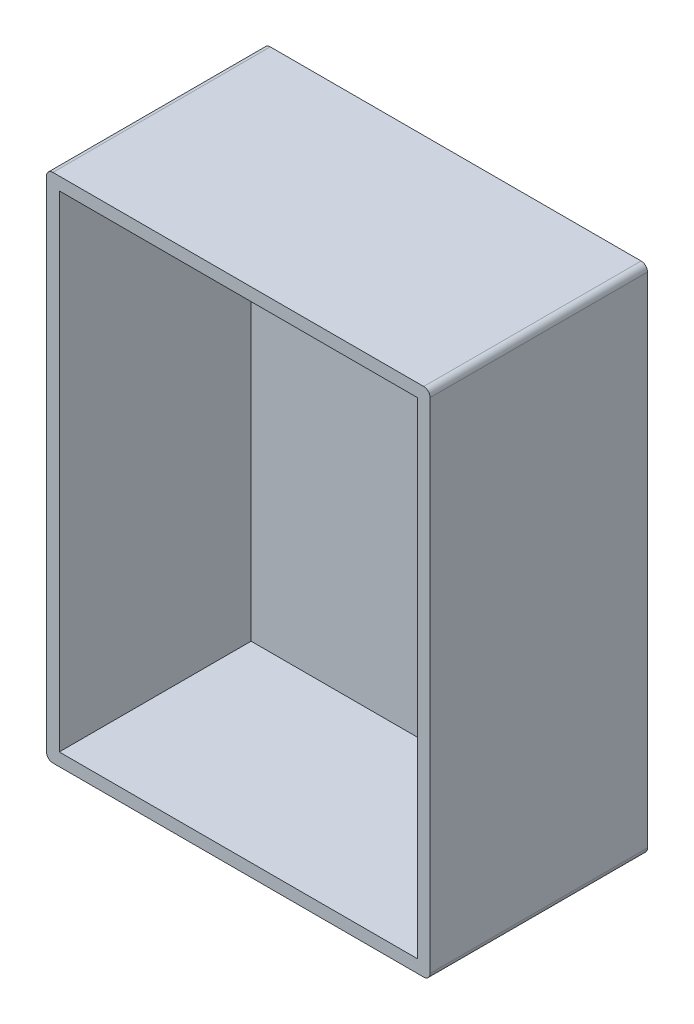
ISO-10303-21;
HEADER;
FILE_DESCRIPTION(('STEP AP214'),'2;1');
FILE_NAME('part.step','',(''),(''),'','','');
FILE_SCHEMA(('AUTOMOTIVE_DESIGN { 1 0 10303 214 1 1 1 1 }'));
ENDSEC;
DATA;
#1=APPLICATION_CONTEXT('core data for automotive mechanical design processes');
#2=APPLICATION_PROTOCOL_DEFINITION('international standard','automotive_design',2000,#1);
#3=PRODUCT_CONTEXT('',#1,'mechanical');
#4=PRODUCT('Part','Part','',(#3));
#5=PRODUCT_RELATED_PRODUCT_CATEGORY('part','',(#4));
#6=PRODUCT_DEFINITION_FORMATION('','',#4);
#7=PRODUCT_DEFINITION_CONTEXT('part definition',#1,'design');
#8=PRODUCT_DEFINITION('design','',#6,#7);
#9=PRODUCT_DEFINITION_SHAPE('','',#8);
#10=(LENGTH_UNIT() NAMED_UNIT(*) SI_UNIT(.MILLI.,.METRE.));
#11=(NAMED_UNIT(*) PLANE_ANGLE_UNIT() SI_UNIT($,.RADIAN.));
#12=(NAMED_UNIT(*) SI_UNIT($,.STERADIAN.) SOLID_ANGLE_UNIT());
#13=UNCERTAINTY_MEASURE_WITH_UNIT(LENGTH_MEASURE(1.E-05),#10,'distance_accuracy_value','');
#14=(GEOMETRIC_REPRESENTATION_CONTEXT(3) GLOBAL_UNCERTAINTY_ASSIGNED_CONTEXT((#13)) GLOBAL_UNIT_ASSIGNED_CONTEXT((#10,
#11,#12)) REPRESENTATION_CONTEXT('',''));
#15=CARTESIAN_POINT('',(0.,0.,0.));
#16=DIRECTION('',(0.,0.,1.));
#17=DIRECTION('',(1.,0.,0.));
#18=AXIS2_PLACEMENT_3D('',#15,#16,#17);
#19=CARTESIAN_POINT('',(150.,200.,170.));
#20=DIRECTION('',(-1.,0.,0.));
#21=DIRECTION('',(0.,0.,1.));
#22=AXIS2_PLACEMENT_3D('',#19,#20,#21);
#23=PLANE('',#22);
#24=DIRECTION('',(0.,1.,0.));
#25=VECTOR('',#24,1.);
#26=CARTESIAN_POINT('',(150.,200.,0.));
#27=LINE('',#26,#25);
#28=CARTESIAN_POINT('',(150.,-195.,0.));
#29=VERTEX_POINT('',#28);
#30=CARTESIAN_POINT('',(150.,195.,0.));
#31=VERTEX_POINT('',#30);
#32=EDGE_CURVE('E165',#29,#31,#27,.T.);
#33=ORIENTED_EDGE('',*,*,#32,.T.);
#34=DIRECTION('',(0.,0.,-1.));
#35=VECTOR('',#34,1.);
#36=CARTESIAN_POINT('',(150.,195.,170.));
#37=LINE('',#36,#35);
#38=CARTESIAN_POINT('',(150.,195.,170.));
#39=VERTEX_POINT('',#38);
#40=EDGE_CURVE('E217',#31,#39,#37,.F.);
#41=ORIENTED_EDGE('',*,*,#40,.T.);
#42=DIRECTION('',(0.,1.,0.));
#43=VECTOR('',#42,1.);
#44=CARTESIAN_POINT('',(150.,200.,170.));
#45=LINE('',#44,#43);
#46=CARTESIAN_POINT('',(150.,-195.,170.));
#47=VERTEX_POINT('',#46);
#48=EDGE_CURVE('E169',#47,#39,#45,.T.);
#49=ORIENTED_EDGE('',*,*,#48,.F.);
#50=DIRECTION('',(0.,0.,-1.));
#51=VECTOR('',#50,1.);
#52=CARTESIAN_POINT('',(150.,-195.,170.));
#53=LINE('',#52,#51);
#54=EDGE_CURVE('E214',#47,#29,#53,.T.);
#55=ORIENTED_EDGE('',*,*,#54,.T.);
#56=EDGE_LOOP('',(#33,#41,#49,#55));
#57=FACE_BOUND('',#56,.T.);
#58=ADVANCED_FACE('F37',(#57),#23,.F.);
#59=CARTESIAN_POINT('',(150.,200.,170.));
#60=DIRECTION('',(0.,-1.,0.));
#61=DIRECTION('',(1.,0.,0.));
#62=AXIS2_PLACEMENT_3D('',#59,#60,#61);
#63=PLANE('',#62);
#64=DIRECTION('',(-1.,0.,0.));
#65=VECTOR('',#64,1.);
#66=CARTESIAN_POINT('',(150.,200.,0.));
#67=LINE('',#66,#65);
#68=CARTESIAN_POINT('',(145.,200.,0.));
#69=VERTEX_POINT('',#68);
#70=CARTESIAN_POINT('',(-145.,200.,0.));
#71=VERTEX_POINT('',#70);
#72=EDGE_CURVE('E183',#69,#71,#67,.T.);
#73=ORIENTED_EDGE('',*,*,#72,.T.);
#74=DIRECTION('',(0.,0.,-1.));
#75=VECTOR('',#74,1.);
#76=CARTESIAN_POINT('',(-145.,200.,170.));
#77=LINE('',#76,#75);
#78=CARTESIAN_POINT('',(-145.,200.,170.));
#79=VERTEX_POINT('',#78);
#80=EDGE_CURVE('E205',#71,#79,#77,.F.);
#81=ORIENTED_EDGE('',*,*,#80,.T.);
#82=DIRECTION('',(-1.,0.,0.));
#83=VECTOR('',#82,1.);
#84=CARTESIAN_POINT('',(150.,200.,170.));
#85=LINE('',#84,#83);
#86=CARTESIAN_POINT('',(145.,200.,170.));
#87=VERTEX_POINT('',#86);
#88=EDGE_CURVE('E172',#87,#79,#85,.T.);
#89=ORIENTED_EDGE('',*,*,#88,.F.);
#90=DIRECTION('',(0.,0.,-1.));
#91=VECTOR('',#90,1.);
#92=CARTESIAN_POINT('',(145.,200.,170.));
#93=LINE('',#92,#91);
#94=EDGE_CURVE('E202',#87,#69,#93,.T.);
#95=ORIENTED_EDGE('',*,*,#94,.T.);
#96=EDGE_LOOP('',(#73,#81,#89,#95));
#97=FACE_BOUND('',#96,.T.);
#98=ADVANCED_FACE('F242',(#97),#63,.F.);
#99=CARTESIAN_POINT('',(-150.,200.,170.));
#100=DIRECTION('',(1.,0.,0.));
#101=DIRECTION('',(0.,0.,-1.));
#102=AXIS2_PLACEMENT_3D('',#99,#100,#101);
#103=PLANE('',#102);
#104=DIRECTION('',(0.,-1.,0.));
#105=VECTOR('',#104,1.);
#106=CARTESIAN_POINT('',(-150.,200.,170.));
#107=LINE('',#106,#105);
#108=CARTESIAN_POINT('',(-150.,195.,170.));
#109=VERTEX_POINT('',#108);
#110=CARTESIAN_POINT('',(-150.,-195.,170.));
#111=VERTEX_POINT('',#110);
#112=EDGE_CURVE('E176',#109,#111,#107,.T.);
#113=ORIENTED_EDGE('',*,*,#112,.F.);
#114=DIRECTION('',(0.,0.,-1.));
#115=VECTOR('',#114,1.);
#116=CARTESIAN_POINT('',(-150.,195.,170.));
#117=LINE('',#116,#115);
#118=CARTESIAN_POINT('',(-150.,195.,0.));
#119=VERTEX_POINT('',#118);
#120=EDGE_CURVE('E191',#109,#119,#117,.T.);
#121=ORIENTED_EDGE('',*,*,#120,.T.);
#122=DIRECTION('',(0.,-1.,0.));
#123=VECTOR('',#122,1.);
#124=CARTESIAN_POINT('',(-150.,200.,0.));
#125=LINE('',#124,#123);
#126=CARTESIAN_POINT('',(-150.,-195.,0.));
#127=VERTEX_POINT('',#126);
#128=EDGE_CURVE('E186',#119,#127,#125,.T.);
#129=ORIENTED_EDGE('',*,*,#128,.T.);
#130=DIRECTION('',(0.,0.,-1.));
#131=VECTOR('',#130,1.);
#132=CARTESIAN_POINT('',(-150.,-195.,170.));
#133=LINE('',#132,#131);
#134=EDGE_CURVE('E180',#127,#111,#133,.F.);
#135=ORIENTED_EDGE('',*,*,#134,.T.);
#136=EDGE_LOOP('',(#113,#121,#129,#135));
#137=FACE_BOUND('',#136,.T.);
#138=ADVANCED_FACE('F250',(#137),#103,.F.);
#139=CARTESIAN_POINT('',(150.,-200.,170.));
#140=DIRECTION('',(0.,1.,0.));
#141=DIRECTION('',(-1.,0.,0.));
#142=AXIS2_PLACEMENT_3D('',#139,#140,#141);
#143=PLANE('',#142);
#144=DIRECTION('',(1.,0.,0.));
#145=VECTOR('',#144,1.);
#146=CARTESIAN_POINT('',(150.,-200.,0.));
#147=LINE('',#146,#145);
#148=CARTESIAN_POINT('',(-145.,-200.,0.));
#149=VERTEX_POINT('',#148);
#150=CARTESIAN_POINT('',(145.,-200.,0.));
#151=VERTEX_POINT('',#150);
#152=EDGE_CURVE('E173',#149,#151,#147,.T.);
#153=ORIENTED_EDGE('',*,*,#152,.T.);
#154=DIRECTION('',(0.,0.,-1.));
#155=VECTOR('',#154,1.);
#156=CARTESIAN_POINT('',(145.,-200.,170.));
#157=LINE('',#156,#155);
#158=CARTESIAN_POINT('',(145.,-200.,170.));
#159=VERTEX_POINT('',#158);
#160=EDGE_CURVE('E11',#151,#159,#157,.F.);
#161=ORIENTED_EDGE('',*,*,#160,.T.);
#162=DIRECTION('',(1.,0.,0.));
#163=VECTOR('',#162,1.);
#164=CARTESIAN_POINT('',(150.,-200.,170.));
#165=LINE('',#164,#163);
#166=CARTESIAN_POINT('',(-145.,-200.,170.));
#167=VERTEX_POINT('',#166);
#168=EDGE_CURVE('E178',#167,#159,#165,.T.);
#169=ORIENTED_EDGE('',*,*,#168,.F.);
#170=DIRECTION('',(0.,0.,-1.));
#171=VECTOR('',#170,1.);
#172=CARTESIAN_POINT('',(-145.,-200.,170.));
#173=LINE('',#172,#171);
#174=EDGE_CURVE('E45',#167,#149,#173,.T.);
#175=ORIENTED_EDGE('',*,*,#174,.T.);
#176=EDGE_LOOP('',(#153,#161,#169,#175));
#177=FACE_BOUND('',#176,.T.);
#178=ADVANCED_FACE('F221',(#177),#143,.F.);
#179=CARTESIAN_POINT('',(0.,0.,170.));
#180=DIRECTION('',(0.,0.,-1.));
#181=DIRECTION('',(-1.,0.,0.));
#182=AXIS2_PLACEMENT_3D('',#179,#180,#181);
#183=PLANE('',#182);
#184=DIRECTION('',(1.,0.,0.));
#185=VECTOR('',#184,1.);
#186=CARTESIAN_POINT('',(-140.,-190.,170.));
#187=LINE('',#186,#185);
#188=CARTESIAN_POINT('',(-140.,-190.,170.));
#189=VERTEX_POINT('',#188);
#190=CARTESIAN_POINT('',(140.,-190.,170.));
#191=VERTEX_POINT('',#190);
#192=EDGE_CURVE('E159',#189,#191,#187,.T.);
#193=ORIENTED_EDGE('',*,*,#192,.F.);
#194=DIRECTION('',(0.,-1.,0.));
#195=VECTOR('',#194,1.);
#196=CARTESIAN_POINT('',(-140.,190.,170.));
#197=LINE('',#196,#195);
#198=CARTESIAN_POINT('',(-140.,190.,170.));
#199=VERTEX_POINT('',#198);
#200=EDGE_CURVE('E133',#199,#189,#197,.T.);
#201=ORIENTED_EDGE('',*,*,#200,.F.);
#202=DIRECTION('',(-1.,0.,0.));
#203=VECTOR('',#202,1.);
#204=CARTESIAN_POINT('',(-140.,190.,170.));
#205=LINE('',#204,#203);
#206=CARTESIAN_POINT('',(140.,190.,170.));
#207=VERTEX_POINT('',#206);
#208=EDGE_CURVE('E150',#207,#199,#205,.T.);
#209=ORIENTED_EDGE('',*,*,#208,.F.);
#210=DIRECTION('',(0.,1.,0.));
#211=VECTOR('',#210,1.);
#212=CARTESIAN_POINT('',(140.,190.,170.));
#213=LINE('',#212,#211);
#214=EDGE_CURVE('E153',#191,#207,#213,.T.);
#215=ORIENTED_EDGE('',*,*,#214,.F.);
#216=EDGE_LOOP('',(#193,#201,#209,#215));
#217=FACE_BOUND('',#216,.T.);
#218=ORIENTED_EDGE('',*,*,#88,.T.);
#219=CARTESIAN_POINT('',(-145.,195.,170.));
#220=DIRECTION('',(0.,0.,-1.));
#221=DIRECTION('',(-1.,0.,0.));
#222=AXIS2_PLACEMENT_3D('',#219,#220,#221);
#223=CIRCLE('',#222,5.);
#224=EDGE_CURVE('E212',#79,#109,#223,.F.);
#225=ORIENTED_EDGE('',*,*,#224,.T.);
#226=ORIENTED_EDGE('',*,*,#112,.T.);
#227=CARTESIAN_POINT('',(-145.,-195.,170.));
#228=DIRECTION('',(0.,0.,-1.));
#229=DIRECTION('',(-1.,0.,0.));
#230=AXIS2_PLACEMENT_3D('',#227,#228,#229);
#231=CIRCLE('',#230,5.);
#232=EDGE_CURVE('E57',#111,#167,#231,.F.);
#233=ORIENTED_EDGE('',*,*,#232,.T.);
#234=ORIENTED_EDGE('',*,*,#168,.T.);
#235=CARTESIAN_POINT('',(145.,-195.,170.));
#236=DIRECTION('',(0.,0.,-1.));
#237=DIRECTION('',(-1.,0.,0.));
#238=AXIS2_PLACEMENT_3D('',#235,#236,#237);
#239=CIRCLE('',#238,5.);
#240=EDGE_CURVE('E208',#159,#47,#239,.F.);
#241=ORIENTED_EDGE('',*,*,#240,.T.);
#242=ORIENTED_EDGE('',*,*,#48,.T.);
#243=CARTESIAN_POINT('',(145.,195.,170.));
#244=DIRECTION('',(0.,0.,-1.));
#245=DIRECTION('',(-1.,0.,0.));
#246=AXIS2_PLACEMENT_3D('',#243,#244,#245);
#247=CIRCLE('',#246,5.);
#248=EDGE_CURVE('E210',#39,#87,#247,.F.);
#249=ORIENTED_EDGE('',*,*,#248,.T.);
#250=EDGE_LOOP('',(#218,#225,#226,#233,#234,#241,#242,#249));
#251=FACE_BOUND('',#250,.T.);
#252=ADVANCED_FACE('F235',(#217,#251),#183,.F.);
#253=CARTESIAN_POINT('',(0.,0.,0.));
#254=DIRECTION('',(0.,0.,-1.));
#255=DIRECTION('',(-1.,0.,0.));
#256=AXIS2_PLACEMENT_3D('',#253,#254,#255);
#257=PLANE('',#256);
#258=ORIENTED_EDGE('',*,*,#128,.F.);
#259=CARTESIAN_POINT('',(-145.,195.,0.));
#260=DIRECTION('',(0.,0.,-1.));
#261=DIRECTION('',(-1.,0.,0.));
#262=AXIS2_PLACEMENT_3D('',#259,#260,#261);
#263=CIRCLE('',#262,5.);
#264=EDGE_CURVE('E200',#119,#71,#263,.T.);
#265=ORIENTED_EDGE('',*,*,#264,.T.);
#266=ORIENTED_EDGE('',*,*,#72,.F.);
#267=CARTESIAN_POINT('',(145.,195.,0.));
#268=DIRECTION('',(0.,0.,-1.));
#269=DIRECTION('',(-1.,0.,0.));
#270=AXIS2_PLACEMENT_3D('',#267,#268,#269);
#271=CIRCLE('',#270,5.);
#272=EDGE_CURVE('E198',#69,#31,#271,.T.);
#273=ORIENTED_EDGE('',*,*,#272,.T.);
#274=ORIENTED_EDGE('',*,*,#32,.F.);
#275=CARTESIAN_POINT('',(145.,-195.,0.));
#276=DIRECTION('',(0.,0.,-1.));
#277=DIRECTION('',(-1.,0.,0.));
#278=AXIS2_PLACEMENT_3D('',#275,#276,#277);
#279=CIRCLE('',#278,5.);
#280=EDGE_CURVE('E196',#29,#151,#279,.T.);
#281=ORIENTED_EDGE('',*,*,#280,.T.);
#282=ORIENTED_EDGE('',*,*,#152,.F.);
#283=CARTESIAN_POINT('',(-145.,-195.,0.));
#284=DIRECTION('',(0.,0.,-1.));
#285=DIRECTION('',(-1.,0.,0.));
#286=AXIS2_PLACEMENT_3D('',#283,#284,#285);
#287=CIRCLE('',#286,5.);
#288=EDGE_CURVE('E194',#149,#127,#287,.T.);
#289=ORIENTED_EDGE('',*,*,#288,.T.);
#290=EDGE_LOOP('',(#258,#265,#266,#273,#274,#281,#282,#289));
#291=FACE_BOUND('',#290,.T.);
#292=ADVANCED_FACE('F225',(#291),#257,.T.);
#293=CARTESIAN_POINT('',(-140.,190.,20.));
#294=DIRECTION('',(-1.,0.,0.));
#295=DIRECTION('',(0.,-1.,0.));
#296=AXIS2_PLACEMENT_3D('',#293,#294,#295);
#297=PLANE('',#296);
#298=ORIENTED_EDGE('',*,*,#200,.T.);
#299=DIRECTION('',(0.,0.,1.));
#300=VECTOR('',#299,1.);
#301=CARTESIAN_POINT('',(-140.,-190.,20.));
#302=LINE('',#301,#300);
#303=CARTESIAN_POINT('',(-140.,-190.,20.));
#304=VERTEX_POINT('',#303);
#305=EDGE_CURVE('E126',#304,#189,#302,.T.);
#306=ORIENTED_EDGE('',*,*,#305,.F.);
#307=DIRECTION('',(0.,-1.,0.));
#308=VECTOR('',#307,1.);
#309=CARTESIAN_POINT('',(-140.,190.,20.));
#310=LINE('',#309,#308);
#311=CARTESIAN_POINT('',(-140.,190.,20.));
#312=VERTEX_POINT('',#311);
#313=EDGE_CURVE('E130',#312,#304,#310,.T.);
#314=ORIENTED_EDGE('',*,*,#313,.F.);
#315=DIRECTION('',(0.,0.,1.));
#316=VECTOR('',#315,1.);
#317=CARTESIAN_POINT('',(-140.,190.,20.));
#318=LINE('',#317,#316);
#319=EDGE_CURVE('E163',#312,#199,#318,.T.);
#320=ORIENTED_EDGE('',*,*,#319,.T.);
#321=EDGE_LOOP('',(#298,#306,#314,#320));
#322=FACE_BOUND('',#321,.T.);
#323=ADVANCED_FACE('F128',(#322),#297,.F.);
#324=CARTESIAN_POINT('',(-140.,190.,20.));
#325=DIRECTION('',(0.,1.,0.));
#326=DIRECTION('',(0.,0.,1.));
#327=AXIS2_PLACEMENT_3D('',#324,#325,#326);
#328=PLANE('',#327);
#329=ORIENTED_EDGE('',*,*,#208,.T.);
#330=ORIENTED_EDGE('',*,*,#319,.F.);
#331=DIRECTION('',(-1.,0.,0.));
#332=VECTOR('',#331,1.);
#333=CARTESIAN_POINT('',(-140.,190.,20.));
#334=LINE('',#333,#332);
#335=CARTESIAN_POINT('',(140.,190.,20.));
#336=VERTEX_POINT('',#335);
#337=EDGE_CURVE('E138',#336,#312,#334,.T.);
#338=ORIENTED_EDGE('',*,*,#337,.F.);
#339=DIRECTION('',(0.,0.,1.));
#340=VECTOR('',#339,1.);
#341=CARTESIAN_POINT('',(140.,190.,20.));
#342=LINE('',#341,#340);
#343=EDGE_CURVE('E166',#336,#207,#342,.T.);
#344=ORIENTED_EDGE('',*,*,#343,.T.);
#345=EDGE_LOOP('',(#329,#330,#338,#344));
#346=FACE_BOUND('',#345,.T.);
#347=ADVANCED_FACE('F311',(#346),#328,.F.);
#348=CARTESIAN_POINT('',(140.,190.,20.));
#349=DIRECTION('',(1.,0.,0.));
#350=DIRECTION('',(0.,1.,0.));
#351=AXIS2_PLACEMENT_3D('',#348,#349,#350);
#352=PLANE('',#351);
#353=ORIENTED_EDGE('',*,*,#214,.T.);
#354=ORIENTED_EDGE('',*,*,#343,.F.);
#355=DIRECTION('',(0.,1.,0.));
#356=VECTOR('',#355,1.);
#357=CARTESIAN_POINT('',(140.,190.,20.));
#358=LINE('',#357,#356);
#359=CARTESIAN_POINT('',(140.,-190.,20.));
#360=VERTEX_POINT('',#359);
#361=EDGE_CURVE('E146',#360,#336,#358,.T.);
#362=ORIENTED_EDGE('',*,*,#361,.F.);
#363=DIRECTION('',(0.,0.,1.));
#364=VECTOR('',#363,1.);
#365=CARTESIAN_POINT('',(140.,-190.,20.));
#366=LINE('',#365,#364);
#367=EDGE_CURVE('E137',#360,#191,#366,.T.);
#368=ORIENTED_EDGE('',*,*,#367,.T.);
#369=EDGE_LOOP('',(#353,#354,#362,#368));
#370=FACE_BOUND('',#369,.T.);
#371=ADVANCED_FACE('F303',(#370),#352,.F.);
#372=CARTESIAN_POINT('',(-140.,-190.,20.));
#373=DIRECTION('',(0.,-1.,0.));
#374=DIRECTION('',(0.,0.,-1.));
#375=AXIS2_PLACEMENT_3D('',#372,#373,#374);
#376=PLANE('',#375);
#377=ORIENTED_EDGE('',*,*,#192,.T.);
#378=ORIENTED_EDGE('',*,*,#367,.F.);
#379=DIRECTION('',(1.,0.,0.));
#380=VECTOR('',#379,1.);
#381=CARTESIAN_POINT('',(-140.,-190.,20.));
#382=LINE('',#381,#380);
#383=EDGE_CURVE('E141',#304,#360,#382,.T.);
#384=ORIENTED_EDGE('',*,*,#383,.F.);
#385=ORIENTED_EDGE('',*,*,#305,.T.);
#386=EDGE_LOOP('',(#377,#378,#384,#385));
#387=FACE_BOUND('',#386,.T.);
#388=ADVANCED_FACE('F142',(#387),#376,.F.);
#389=CARTESIAN_POINT('',(0.,0.,20.));
#390=DIRECTION('',(0.,0.,1.));
#391=DIRECTION('',(1.,0.,0.));
#392=AXIS2_PLACEMENT_3D('',#389,#390,#391);
#393=PLANE('',#392);
#394=ORIENTED_EDGE('',*,*,#313,.T.);
#395=ORIENTED_EDGE('',*,*,#383,.T.);
#396=ORIENTED_EDGE('',*,*,#361,.T.);
#397=ORIENTED_EDGE('',*,*,#337,.T.);
#398=EDGE_LOOP('',(#394,#395,#396,#397));
#399=FACE_BOUND('',#398,.T.);
#400=ADVANCED_FACE('F148',(#399),#393,.T.);
#401=CARTESIAN_POINT('',(-145.,195.,170.));
#402=DIRECTION('',(0.,0.,-1.));
#403=DIRECTION('',(-1.,0.,0.));
#404=AXIS2_PLACEMENT_3D('',#401,#402,#403);
#405=CYLINDRICAL_SURFACE('',#404,5.);
#406=ORIENTED_EDGE('',*,*,#224,.F.);
#407=ORIENTED_EDGE('',*,*,#80,.F.);
#408=ORIENTED_EDGE('',*,*,#264,.F.);
#409=ORIENTED_EDGE('',*,*,#120,.F.);
#410=EDGE_LOOP('',(#406,#407,#408,#409));
#411=FACE_BOUND('',#410,.T.);
#412=ADVANCED_FACE('F247',(#411),#405,.T.);
#413=CARTESIAN_POINT('',(145.,195.,170.));
#414=DIRECTION('',(0.,0.,-1.));
#415=DIRECTION('',(-1.,0.,0.));
#416=AXIS2_PLACEMENT_3D('',#413,#414,#415);
#417=CYLINDRICAL_SURFACE('',#416,5.);
#418=ORIENTED_EDGE('',*,*,#248,.F.);
#419=ORIENTED_EDGE('',*,*,#40,.F.);
#420=ORIENTED_EDGE('',*,*,#272,.F.);
#421=ORIENTED_EDGE('',*,*,#94,.F.);
#422=EDGE_LOOP('',(#418,#419,#420,#421));
#423=FACE_BOUND('',#422,.T.);
#424=ADVANCED_FACE('F239',(#423),#417,.T.);
#425=CARTESIAN_POINT('',(145.,-195.,170.));
#426=DIRECTION('',(0.,0.,-1.));
#427=DIRECTION('',(-1.,0.,0.));
#428=AXIS2_PLACEMENT_3D('',#425,#426,#427);
#429=CYLINDRICAL_SURFACE('',#428,5.);
#430=ORIENTED_EDGE('',*,*,#240,.F.);
#431=ORIENTED_EDGE('',*,*,#160,.F.);
#432=ORIENTED_EDGE('',*,*,#280,.F.);
#433=ORIENTED_EDGE('',*,*,#54,.F.);
#434=EDGE_LOOP('',(#430,#431,#432,#433));
#435=FACE_BOUND('',#434,.T.);
#436=ADVANCED_FACE('F230',(#435),#429,.T.);
#437=CARTESIAN_POINT('',(-145.,-195.,170.));
#438=DIRECTION('',(0.,0.,-1.));
#439=DIRECTION('',(-1.,0.,0.));
#440=AXIS2_PLACEMENT_3D('',#437,#438,#439);
#441=CYLINDRICAL_SURFACE('',#440,5.);
#442=ORIENTED_EDGE('',*,*,#232,.F.);
#443=ORIENTED_EDGE('',*,*,#134,.F.);
#444=ORIENTED_EDGE('',*,*,#288,.F.);
#445=ORIENTED_EDGE('',*,*,#174,.F.);
#446=EDGE_LOOP('',(#442,#443,#444,#445));
#447=FACE_BOUND('',#446,.T.);
#448=ADVANCED_FACE('F39',(#447),#441,.T.);
#449=CLOSED_SHELL('',(#58,#98,#138,#178,#252,#292,#323,#347,#371,#388,#400,#412,#424,#436,#448));
#450=MANIFOLD_SOLID_BREP('B2',#449);
#451=ADVANCED_BREP_SHAPE_REPRESENTATION('',(#18,#450),#14);
#452=SHAPE_DEFINITION_REPRESENTATION(#9,#451);
ENDSEC;
END-ISO-10303-21;
